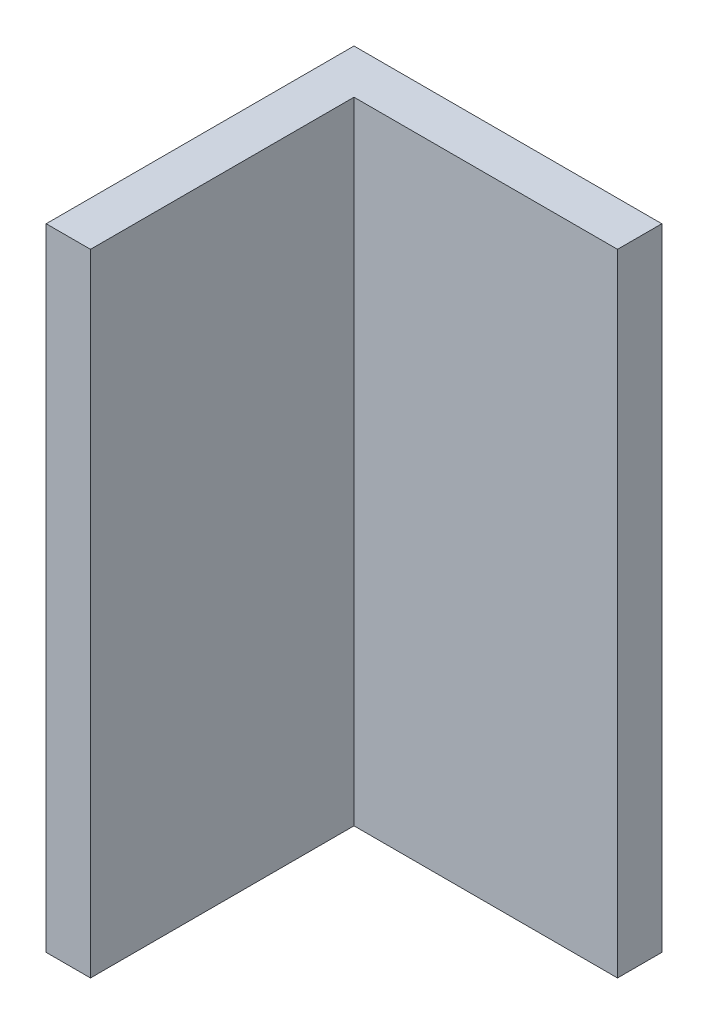
ISO-10303-21;
HEADER;
FILE_DESCRIPTION(('STEP AP214'),'2;1');
FILE_NAME('part.step','',(''),(''),'','','');
FILE_SCHEMA(('AUTOMOTIVE_DESIGN { 1 0 10303 214 1 1 1 1 }'));
ENDSEC;
DATA;
#1=APPLICATION_CONTEXT('core data for automotive mechanical design processes');
#2=APPLICATION_PROTOCOL_DEFINITION('international standard','automotive_design',2000,#1);
#3=PRODUCT_CONTEXT('',#1,'mechanical');
#4=PRODUCT('Part','Part','',(#3));
#5=PRODUCT_RELATED_PRODUCT_CATEGORY('part','',(#4));
#6=PRODUCT_DEFINITION_FORMATION('','',#4);
#7=PRODUCT_DEFINITION_CONTEXT('part definition',#1,'design');
#8=PRODUCT_DEFINITION('design','',#6,#7);
#9=PRODUCT_DEFINITION_SHAPE('','',#8);
#10=(LENGTH_UNIT() NAMED_UNIT(*) SI_UNIT(.MILLI.,.METRE.));
#11=(NAMED_UNIT(*) PLANE_ANGLE_UNIT() SI_UNIT($,.RADIAN.));
#12=(NAMED_UNIT(*) SI_UNIT($,.STERADIAN.) SOLID_ANGLE_UNIT());
#13=UNCERTAINTY_MEASURE_WITH_UNIT(LENGTH_MEASURE(1.E-05),#10,'distance_accuracy_value','');
#14=(GEOMETRIC_REPRESENTATION_CONTEXT(3) GLOBAL_UNCERTAINTY_ASSIGNED_CONTEXT((#13)) GLOBAL_UNIT_ASSIGNED_CONTEXT((#10,
#11,#12)) REPRESENTATION_CONTEXT('',''));
#15=CARTESIAN_POINT('',(0.,0.,0.));
#16=DIRECTION('',(0.,0.,1.));
#17=DIRECTION('',(1.,0.,0.));
#18=AXIS2_PLACEMENT_3D('',#15,#16,#17);
#19=CARTESIAN_POINT('',(0.,52.07,0.));
#20=DIRECTION('',(1.,0.,0.));
#21=DIRECTION('',(0.,0.,-1.));
#22=AXIS2_PLACEMENT_3D('',#19,#20,#21);
#23=PLANE('',#22);
#24=DIRECTION('',(0.,0.,1.));
#25=VECTOR('',#24,1.);
#26=CARTESIAN_POINT('',(0.,0.,0.));
#27=LINE('',#26,#25);
#28=CARTESIAN_POINT('',(0.,0.,0.));
#29=VERTEX_POINT('',#28);
#30=CARTESIAN_POINT('',(0.,0.,25.4));
#31=VERTEX_POINT('',#30);
#32=EDGE_CURVE('E119',#29,#31,#27,.T.);
#33=ORIENTED_EDGE('',*,*,#32,.T.);
#34=DIRECTION('',(0.,-1.,0.));
#35=VECTOR('',#34,1.);
#36=CARTESIAN_POINT('',(0.,52.07,25.4));
#37=LINE('',#36,#35);
#38=CARTESIAN_POINT('',(0.,52.07,25.4));
#39=VERTEX_POINT('',#38);
#40=EDGE_CURVE('E11',#39,#31,#37,.T.);
#41=ORIENTED_EDGE('',*,*,#40,.F.);
#42=DIRECTION('',(0.,0.,1.));
#43=VECTOR('',#42,1.);
#44=CARTESIAN_POINT('',(0.,52.07,0.));
#45=LINE('',#44,#43);
#46=CARTESIAN_POINT('',(0.,52.07,0.));
#47=VERTEX_POINT('',#46);
#48=EDGE_CURVE('E116',#47,#39,#45,.T.);
#49=ORIENTED_EDGE('',*,*,#48,.F.);
#50=DIRECTION('',(0.,-1.,0.));
#51=VECTOR('',#50,1.);
#52=CARTESIAN_POINT('',(0.,52.07,0.));
#53=LINE('',#52,#51);
#54=EDGE_CURVE('E123',#47,#29,#53,.T.);
#55=ORIENTED_EDGE('',*,*,#54,.T.);
#56=EDGE_LOOP('',(#33,#41,#49,#55));
#57=FACE_BOUND('',#56,.T.);
#58=ADVANCED_FACE('F33',(#57),#23,.F.);
#59=CARTESIAN_POINT('',(0.,52.07,25.4));
#60=DIRECTION('',(0.,0.,-1.));
#61=DIRECTION('',(-1.,0.,0.));
#62=AXIS2_PLACEMENT_3D('',#59,#60,#61);
#63=PLANE('',#62);
#64=DIRECTION('',(1.,0.,0.));
#65=VECTOR('',#64,1.);
#66=CARTESIAN_POINT('',(0.,0.,25.4));
#67=LINE('',#66,#65);
#68=CARTESIAN_POINT('',(3.6576,0.,25.4));
#69=VERTEX_POINT('',#68);
#70=EDGE_CURVE('E114',#31,#69,#67,.T.);
#71=ORIENTED_EDGE('',*,*,#70,.T.);
#72=DIRECTION('',(0.,1.,0.));
#73=VECTOR('',#72,1.);
#74=CARTESIAN_POINT('',(3.6576,0.,25.4));
#75=LINE('',#74,#73);
#76=CARTESIAN_POINT('',(3.6576,52.07,25.4));
#77=VERTEX_POINT('',#76);
#78=EDGE_CURVE('E130',#69,#77,#75,.T.);
#79=ORIENTED_EDGE('',*,*,#78,.T.);
#80=DIRECTION('',(1.,0.,0.));
#81=VECTOR('',#80,1.);
#82=CARTESIAN_POINT('',(0.,52.07,25.4));
#83=LINE('',#82,#81);
#84=EDGE_CURVE('E79',#39,#77,#83,.T.);
#85=ORIENTED_EDGE('',*,*,#84,.F.);
#86=ORIENTED_EDGE('',*,*,#40,.T.);
#87=EDGE_LOOP('',(#71,#79,#85,#86));
#88=FACE_BOUND('',#87,.T.);
#89=ADVANCED_FACE('F140',(#88),#63,.F.);
#90=CARTESIAN_POINT('',(25.4,52.07,0.));
#91=DIRECTION('',(-1.,0.,0.));
#92=DIRECTION('',(0.,0.,1.));
#93=AXIS2_PLACEMENT_3D('',#90,#91,#92);
#94=PLANE('',#93);
#95=DIRECTION('',(0.,0.,-1.));
#96=VECTOR('',#95,1.);
#97=CARTESIAN_POINT('',(25.4,52.07,0.));
#98=LINE('',#97,#96);
#99=CARTESIAN_POINT('',(25.4,52.07,3.6576));
#100=VERTEX_POINT('',#99);
#101=CARTESIAN_POINT('',(25.4,52.07,0.));
#102=VERTEX_POINT('',#101);
#103=EDGE_CURVE('E110',#100,#102,#98,.T.);
#104=ORIENTED_EDGE('',*,*,#103,.F.);
#105=DIRECTION('',(0.,1.,0.));
#106=VECTOR('',#105,1.);
#107=CARTESIAN_POINT('',(25.4,0.,3.6576));
#108=LINE('',#107,#106);
#109=CARTESIAN_POINT('',(25.4,0.,3.6576));
#110=VERTEX_POINT('',#109);
#111=EDGE_CURVE('E98',#110,#100,#108,.T.);
#112=ORIENTED_EDGE('',*,*,#111,.F.);
#113=DIRECTION('',(0.,0.,-1.));
#114=VECTOR('',#113,1.);
#115=CARTESIAN_POINT('',(25.4,0.,0.));
#116=LINE('',#115,#114);
#117=CARTESIAN_POINT('',(25.4,0.,0.));
#118=VERTEX_POINT('',#117);
#119=EDGE_CURVE('E109',#110,#118,#116,.T.);
#120=ORIENTED_EDGE('',*,*,#119,.T.);
#121=DIRECTION('',(0.,-1.,0.));
#122=VECTOR('',#121,1.);
#123=CARTESIAN_POINT('',(25.4,52.07,0.));
#124=LINE('',#123,#122);
#125=EDGE_CURVE('E40',#102,#118,#124,.T.);
#126=ORIENTED_EDGE('',*,*,#125,.F.);
#127=EDGE_LOOP('',(#104,#112,#120,#126));
#128=FACE_BOUND('',#127,.T.);
#129=ADVANCED_FACE('F107',(#128),#94,.F.);
#130=CARTESIAN_POINT('',(0.,52.07,0.));
#131=DIRECTION('',(0.,0.,1.));
#132=DIRECTION('',(1.,0.,0.));
#133=AXIS2_PLACEMENT_3D('',#130,#131,#132);
#134=PLANE('',#133);
#135=DIRECTION('',(-1.,0.,0.));
#136=VECTOR('',#135,1.);
#137=CARTESIAN_POINT('',(0.,0.,0.));
#138=LINE('',#137,#136);
#139=EDGE_CURVE('E73',#118,#29,#138,.T.);
#140=ORIENTED_EDGE('',*,*,#139,.T.);
#141=ORIENTED_EDGE('',*,*,#54,.F.);
#142=DIRECTION('',(-1.,0.,0.));
#143=VECTOR('',#142,1.);
#144=CARTESIAN_POINT('',(0.,52.07,0.));
#145=LINE('',#144,#143);
#146=EDGE_CURVE('E56',#102,#47,#145,.T.);
#147=ORIENTED_EDGE('',*,*,#146,.F.);
#148=ORIENTED_EDGE('',*,*,#125,.T.);
#149=EDGE_LOOP('',(#140,#141,#147,#148));
#150=FACE_BOUND('',#149,.T.);
#151=ADVANCED_FACE('F124',(#150),#134,.F.);
#152=CARTESIAN_POINT('',(0.,52.07,0.));
#153=DIRECTION('',(0.,1.,0.));
#154=DIRECTION('',(0.,0.,1.));
#155=AXIS2_PLACEMENT_3D('',#152,#153,#154);
#156=PLANE('',#155);
#157=DIRECTION('',(0.,0.,1.));
#158=VECTOR('',#157,1.);
#159=CARTESIAN_POINT('',(3.6576,52.07,3.6576));
#160=LINE('',#159,#158);
#161=CARTESIAN_POINT('',(3.6576,52.07,3.6576));
#162=VERTEX_POINT('',#161);
#163=EDGE_CURVE('E103',#162,#77,#160,.T.);
#164=ORIENTED_EDGE('',*,*,#163,.F.);
#165=DIRECTION('',(-1.,0.,0.));
#166=VECTOR('',#165,1.);
#167=CARTESIAN_POINT('',(25.4,52.07,3.6576));
#168=LINE('',#167,#166);
#169=EDGE_CURVE('E142',#100,#162,#168,.T.);
#170=ORIENTED_EDGE('',*,*,#169,.F.);
#171=ORIENTED_EDGE('',*,*,#103,.T.);
#172=ORIENTED_EDGE('',*,*,#146,.T.);
#173=ORIENTED_EDGE('',*,*,#48,.T.);
#174=ORIENTED_EDGE('',*,*,#84,.T.);
#175=EDGE_LOOP('',(#164,#170,#171,#172,#173,#174));
#176=FACE_BOUND('',#175,.T.);
#177=ADVANCED_FACE('F139',(#176),#156,.T.);
#178=CARTESIAN_POINT('',(0.,0.,0.));
#179=DIRECTION('',(0.,1.,0.));
#180=DIRECTION('',(0.,0.,1.));
#181=AXIS2_PLACEMENT_3D('',#178,#179,#180);
#182=PLANE('',#181);
#183=DIRECTION('',(-1.,0.,0.));
#184=VECTOR('',#183,1.);
#185=CARTESIAN_POINT('',(25.4,0.,3.6576));
#186=LINE('',#185,#184);
#187=CARTESIAN_POINT('',(3.6576,0.,3.6576));
#188=VERTEX_POINT('',#187);
#189=EDGE_CURVE('E94',#110,#188,#186,.T.);
#190=ORIENTED_EDGE('',*,*,#189,.T.);
#191=DIRECTION('',(0.,0.,1.));
#192=VECTOR('',#191,1.);
#193=CARTESIAN_POINT('',(3.6576,0.,3.6576));
#194=LINE('',#193,#192);
#195=EDGE_CURVE('E47',#188,#69,#194,.T.);
#196=ORIENTED_EDGE('',*,*,#195,.T.);
#197=ORIENTED_EDGE('',*,*,#70,.F.);
#198=ORIENTED_EDGE('',*,*,#32,.F.);
#199=ORIENTED_EDGE('',*,*,#139,.F.);
#200=ORIENTED_EDGE('',*,*,#119,.F.);
#201=EDGE_LOOP('',(#190,#196,#197,#198,#199,#200));
#202=FACE_BOUND('',#201,.T.);
#203=ADVANCED_FACE('F112',(#202),#182,.F.);
#204=CARTESIAN_POINT('',(3.6576,0.,3.6576));
#205=DIRECTION('',(-1.,0.,0.));
#206=DIRECTION('',(0.,0.,1.));
#207=AXIS2_PLACEMENT_3D('',#204,#205,#206);
#208=PLANE('',#207);
#209=ORIENTED_EDGE('',*,*,#163,.T.);
#210=ORIENTED_EDGE('',*,*,#78,.F.);
#211=ORIENTED_EDGE('',*,*,#195,.F.);
#212=DIRECTION('',(0.,1.,0.));
#213=VECTOR('',#212,1.);
#214=CARTESIAN_POINT('',(3.6576,0.,3.6576));
#215=LINE('',#214,#213);
#216=EDGE_CURVE('E100',#188,#162,#215,.T.);
#217=ORIENTED_EDGE('',*,*,#216,.T.);
#218=EDGE_LOOP('',(#209,#210,#211,#217));
#219=FACE_BOUND('',#218,.T.);
#220=ADVANCED_FACE('F143',(#219),#208,.F.);
#221=CARTESIAN_POINT('',(25.4,0.,3.6576));
#222=DIRECTION('',(0.,0.,-1.));
#223=DIRECTION('',(-1.,0.,0.));
#224=AXIS2_PLACEMENT_3D('',#221,#222,#223);
#225=PLANE('',#224);
#226=ORIENTED_EDGE('',*,*,#169,.T.);
#227=ORIENTED_EDGE('',*,*,#216,.F.);
#228=ORIENTED_EDGE('',*,*,#189,.F.);
#229=ORIENTED_EDGE('',*,*,#111,.T.);
#230=EDGE_LOOP('',(#226,#227,#228,#229));
#231=FACE_BOUND('',#230,.T.);
#232=ADVANCED_FACE('F97',(#231),#225,.F.);
#233=CLOSED_SHELL('',(#58,#89,#129,#151,#177,#203,#220,#232));
#234=MANIFOLD_SOLID_BREP('B2',#233);
#235=ADVANCED_BREP_SHAPE_REPRESENTATION('',(#18,#234),#14);
#236=SHAPE_DEFINITION_REPRESENTATION(#9,#235);
ENDSEC;
END-ISO-10303-21;
